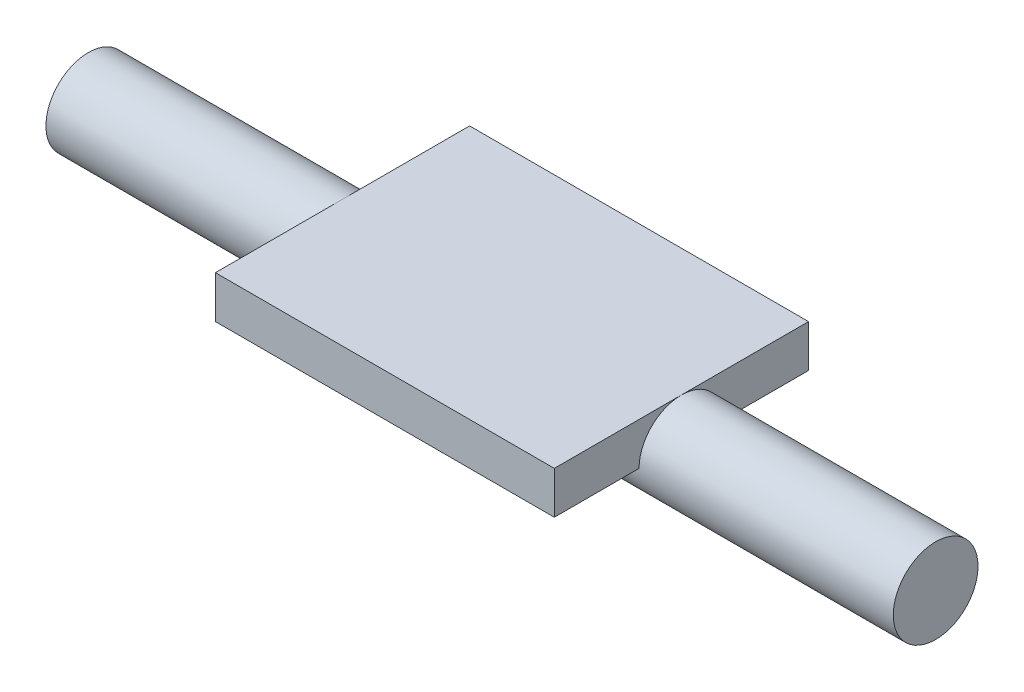
ISO-10303-21;
HEADER;
FILE_DESCRIPTION(('STEP AP214'),'2;1');
FILE_NAME('part.step','',(''),(''),'','','');
FILE_SCHEMA(('AUTOMOTIVE_DESIGN { 1 0 10303 214 1 1 1 1 }'));
ENDSEC;
DATA;
#1=APPLICATION_CONTEXT('core data for automotive mechanical design processes');
#2=APPLICATION_PROTOCOL_DEFINITION('international standard','automotive_design',2000,#1);
#3=PRODUCT_CONTEXT('',#1,'mechanical');
#4=PRODUCT('Part','Part','',(#3));
#5=PRODUCT_RELATED_PRODUCT_CATEGORY('part','',(#4));
#6=PRODUCT_DEFINITION_FORMATION('','',#4);
#7=PRODUCT_DEFINITION_CONTEXT('part definition',#1,'design');
#8=PRODUCT_DEFINITION('design','',#6,#7);
#9=PRODUCT_DEFINITION_SHAPE('','',#8);
#10=(LENGTH_UNIT() NAMED_UNIT(*) SI_UNIT(.MILLI.,.METRE.));
#11=(NAMED_UNIT(*) PLANE_ANGLE_UNIT() SI_UNIT($,.RADIAN.));
#12=(NAMED_UNIT(*) SI_UNIT($,.STERADIAN.) SOLID_ANGLE_UNIT());
#13=UNCERTAINTY_MEASURE_WITH_UNIT(LENGTH_MEASURE(1.E-05),#10,'distance_accuracy_value','');
#14=(GEOMETRIC_REPRESENTATION_CONTEXT(3) GLOBAL_UNCERTAINTY_ASSIGNED_CONTEXT((#13)) GLOBAL_UNIT_ASSIGNED_CONTEXT((#10,
#11,#12)) REPRESENTATION_CONTEXT('',''));
#15=CARTESIAN_POINT('',(0.,0.,0.));
#16=DIRECTION('',(0.,0.,1.));
#17=DIRECTION('',(1.,0.,0.));
#18=AXIS2_PLACEMENT_3D('',#15,#16,#17);
#19=CARTESIAN_POINT('',(-50.,0.,0.));
#20=DIRECTION('',(1.,0.,0.));
#21=DIRECTION('',(0.,0.,-1.));
#22=AXIS2_PLACEMENT_3D('',#19,#20,#21);
#23=CYLINDRICAL_SURFACE('',#22,2.5);
#24=CARTESIAN_POINT('',(-35.,0.,0.));
#25=DIRECTION('',(1.,0.,0.));
#26=DIRECTION('',(0.,0.,1.));
#27=AXIS2_PLACEMENT_3D('',#24,#25,#26);
#28=CIRCLE('',#27,2.5);
#29=CARTESIAN_POINT('',(-35.,0.,-2.5));
#30=VERTEX_POINT('',#29);
#31=CARTESIAN_POINT('',(-35.,2.5,0.));
#32=VERTEX_POINT('',#31);
#33=EDGE_CURVE('E124',#30,#32,#28,.T.);
#34=ORIENTED_EDGE('',*,*,#33,.F.);
#35=DIRECTION('',(1.,0.,0.));
#36=VECTOR('',#35,1.);
#37=CARTESIAN_POINT('',(-35.,0.,-2.5));
#38=LINE('',#37,#36);
#39=CARTESIAN_POINT('',(-15.,0.,-2.5));
#40=VERTEX_POINT('',#39);
#41=EDGE_CURVE('E127',#30,#40,#38,.T.);
#42=ORIENTED_EDGE('',*,*,#41,.T.);
#43=CARTESIAN_POINT('',(-15.,0.,0.));
#44=DIRECTION('',(1.,0.,0.));
#45=DIRECTION('',(0.,0.,1.));
#46=AXIS2_PLACEMENT_3D('',#43,#44,#45);
#47=CIRCLE('',#46,2.5);
#48=CARTESIAN_POINT('',(-15.,2.5,0.));
#49=VERTEX_POINT('',#48);
#50=EDGE_CURVE('E56',#40,#49,#47,.T.);
#51=ORIENTED_EDGE('',*,*,#50,.T.);
#52=CARTESIAN_POINT('',(-15.,0.,2.5));
#53=VERTEX_POINT('',#52);
#54=EDGE_CURVE('E117',#49,#53,#47,.T.);
#55=ORIENTED_EDGE('',*,*,#54,.T.);
#56=DIRECTION('',(1.,0.,0.));
#57=VECTOR('',#56,1.);
#58=CARTESIAN_POINT('',(-35.,0.,2.5));
#59=LINE('',#58,#57);
#60=CARTESIAN_POINT('',(-35.,0.,2.5));
#61=VERTEX_POINT('',#60);
#62=EDGE_CURVE('E125',#61,#53,#59,.T.);
#63=ORIENTED_EDGE('',*,*,#62,.F.);
#64=EDGE_CURVE('E49',#32,#61,#28,.T.);
#65=ORIENTED_EDGE('',*,*,#64,.F.);
#66=EDGE_LOOP('',(#34,#42,#51,#55,#63,#65));
#67=FACE_BOUND('',#66,.T.);
#68=CARTESIAN_POINT('',(-50.,0.,0.));
#69=DIRECTION('',(1.,0.,0.));
#70=DIRECTION('',(0.,0.,-1.));
#71=AXIS2_PLACEMENT_3D('',#68,#69,#70);
#72=CIRCLE('',#71,2.5);
#73=CARTESIAN_POINT('',(-50.,0.,-2.5));
#74=VERTEX_POINT('',#73);
#75=EDGE_CURVE('E11',#74,#74,#72,.T.);
#76=ORIENTED_EDGE('',*,*,#75,.T.);
#77=EDGE_LOOP('',(#76));
#78=FACE_BOUND('',#77,.T.);
#79=CARTESIAN_POINT('',(0.,0.,0.));
#80=DIRECTION('',(1.,0.,0.));
#81=DIRECTION('',(0.,0.,-1.));
#82=AXIS2_PLACEMENT_3D('',#79,#80,#81);
#83=CIRCLE('',#82,2.5);
#84=CARTESIAN_POINT('',(0.,0.,-2.5));
#85=VERTEX_POINT('',#84);
#86=EDGE_CURVE('E38',#85,#85,#83,.T.);
#87=ORIENTED_EDGE('',*,*,#86,.F.);
#88=EDGE_LOOP('',(#87));
#89=FACE_BOUND('',#88,.T.);
#90=ADVANCED_FACE('F35',(#67,#78,#89),#23,.T.);
#91=CARTESIAN_POINT('',(-50.,0.,0.));
#92=DIRECTION('',(1.,0.,0.));
#93=DIRECTION('',(0.,0.,-1.));
#94=AXIS2_PLACEMENT_3D('',#91,#92,#93);
#95=PLANE('',#94);
#96=ORIENTED_EDGE('',*,*,#75,.F.);
#97=EDGE_LOOP('',(#96));
#98=FACE_BOUND('',#97,.T.);
#99=ADVANCED_FACE('F182',(#98),#95,.F.);
#100=CARTESIAN_POINT('',(0.,0.,0.));
#101=DIRECTION('',(1.,0.,0.));
#102=DIRECTION('',(0.,0.,-1.));
#103=AXIS2_PLACEMENT_3D('',#100,#101,#102);
#104=PLANE('',#103);
#105=ORIENTED_EDGE('',*,*,#86,.T.);
#106=EDGE_LOOP('',(#105));
#107=FACE_BOUND('',#106,.T.);
#108=ADVANCED_FACE('F186',(#107),#104,.T.);
#109=CARTESIAN_POINT('',(-15.,2.5,7.5));
#110=DIRECTION('',(-1.,0.,0.));
#111=DIRECTION('',(0.,0.,1.));
#112=AXIS2_PLACEMENT_3D('',#109,#110,#111);
#113=PLANE('',#112);
#114=ORIENTED_EDGE('',*,*,#50,.F.);
#115=DIRECTION('',(0.,0.,-1.));
#116=VECTOR('',#115,1.);
#117=CARTESIAN_POINT('',(-15.,0.,7.5));
#118=LINE('',#117,#116);
#119=CARTESIAN_POINT('',(-15.,0.,-7.5));
#120=VERTEX_POINT('',#119);
#121=EDGE_CURVE('E115',#40,#120,#118,.T.);
#122=ORIENTED_EDGE('',*,*,#121,.T.);
#123=DIRECTION('',(0.,-1.,0.));
#124=VECTOR('',#123,1.);
#125=CARTESIAN_POINT('',(-15.,2.5,-7.5));
#126=LINE('',#125,#124);
#127=CARTESIAN_POINT('',(-15.,2.5,-7.5));
#128=VERTEX_POINT('',#127);
#129=EDGE_CURVE('E107',#128,#120,#126,.T.);
#130=ORIENTED_EDGE('',*,*,#129,.F.);
#131=DIRECTION('',(0.,0.,-1.));
#132=VECTOR('',#131,1.);
#133=CARTESIAN_POINT('',(-15.,2.5,7.5));
#134=LINE('',#133,#132);
#135=EDGE_CURVE('E92',#49,#128,#134,.T.);
#136=ORIENTED_EDGE('',*,*,#135,.F.);
#137=EDGE_LOOP('',(#114,#122,#130,#136));
#138=FACE_BOUND('',#137,.T.);
#139=ADVANCED_FACE('F113',(#138),#113,.F.);
#140=CARTESIAN_POINT('',(-35.,2.5,7.5));
#141=DIRECTION('',(1.,0.,0.));
#142=DIRECTION('',(0.,0.,-1.));
#143=AXIS2_PLACEMENT_3D('',#140,#141,#142);
#144=PLANE('',#143);
#145=ORIENTED_EDGE('',*,*,#64,.T.);
#146=DIRECTION('',(0.,0.,1.));
#147=VECTOR('',#146,1.);
#148=CARTESIAN_POINT('',(-35.,0.,7.5));
#149=LINE('',#148,#147);
#150=CARTESIAN_POINT('',(-35.,0.,7.5));
#151=VERTEX_POINT('',#150);
#152=EDGE_CURVE('E137',#61,#151,#149,.T.);
#153=ORIENTED_EDGE('',*,*,#152,.T.);
#154=DIRECTION('',(0.,-1.,0.));
#155=VECTOR('',#154,1.);
#156=CARTESIAN_POINT('',(-35.,2.5,7.5));
#157=LINE('',#156,#155);
#158=CARTESIAN_POINT('',(-35.,2.5,7.5));
#159=VERTEX_POINT('',#158);
#160=EDGE_CURVE('E120',#159,#151,#157,.T.);
#161=ORIENTED_EDGE('',*,*,#160,.F.);
#162=DIRECTION('',(0.,0.,1.));
#163=VECTOR('',#162,1.);
#164=CARTESIAN_POINT('',(-35.,2.5,7.5));
#165=LINE('',#164,#163);
#166=EDGE_CURVE('E111',#32,#159,#165,.T.);
#167=ORIENTED_EDGE('',*,*,#166,.F.);
#168=EDGE_LOOP('',(#145,#153,#161,#167));
#169=FACE_BOUND('',#168,.T.);
#170=ADVANCED_FACE('F161',(#169),#144,.F.);
#171=CARTESIAN_POINT('',(0.,0.,0.));
#172=DIRECTION('',(0.,-1.,0.));
#173=DIRECTION('',(0.,0.,-1.));
#174=AXIS2_PLACEMENT_3D('',#171,#172,#173);
#175=PLANE('',#174);
#176=ORIENTED_EDGE('',*,*,#121,.F.);
#177=ORIENTED_EDGE('',*,*,#41,.F.);
#178=CARTESIAN_POINT('',(-35.,0.,-7.5));
#179=VERTEX_POINT('',#178);
#180=EDGE_CURVE('E150',#179,#30,#149,.T.);
#181=ORIENTED_EDGE('',*,*,#180,.F.);
#182=DIRECTION('',(-1.,0.,0.));
#183=VECTOR('',#182,1.);
#184=CARTESIAN_POINT('',(-35.,0.,-7.5));
#185=LINE('',#184,#183);
#186=EDGE_CURVE('E143',#120,#179,#185,.T.);
#187=ORIENTED_EDGE('',*,*,#186,.F.);
#188=EDGE_LOOP('',(#176,#177,#181,#187));
#189=FACE_BOUND('',#188,.T.);
#190=ADVANCED_FACE('F169',(#189),#175,.T.);
#191=ORIENTED_EDGE('',*,*,#54,.F.);
#192=CARTESIAN_POINT('',(-15.,2.5,7.5));
#193=VERTEX_POINT('',#192);
#194=EDGE_CURVE('E99',#193,#49,#134,.T.);
#195=ORIENTED_EDGE('',*,*,#194,.F.);
#196=DIRECTION('',(0.,-1.,0.));
#197=VECTOR('',#196,1.);
#198=CARTESIAN_POINT('',(-15.,2.5,7.5));
#199=LINE('',#198,#197);
#200=CARTESIAN_POINT('',(-15.,0.,7.5));
#201=VERTEX_POINT('',#200);
#202=EDGE_CURVE('E142',#193,#201,#199,.T.);
#203=ORIENTED_EDGE('',*,*,#202,.T.);
#204=EDGE_CURVE('E136',#201,#53,#118,.T.);
#205=ORIENTED_EDGE('',*,*,#204,.T.);
#206=EDGE_LOOP('',(#191,#195,#203,#205));
#207=FACE_BOUND('',#206,.T.);
#208=ADVANCED_FACE('F140',(#207),#113,.F.);
#209=CARTESIAN_POINT('',(-35.,2.5,-7.5));
#210=DIRECTION('',(0.,0.,1.));
#211=DIRECTION('',(1.,0.,0.));
#212=AXIS2_PLACEMENT_3D('',#209,#210,#211);
#213=PLANE('',#212);
#214=ORIENTED_EDGE('',*,*,#186,.T.);
#215=DIRECTION('',(0.,-1.,0.));
#216=VECTOR('',#215,1.);
#217=CARTESIAN_POINT('',(-35.,2.5,-7.5));
#218=LINE('',#217,#216);
#219=CARTESIAN_POINT('',(-35.,2.5,-7.5));
#220=VERTEX_POINT('',#219);
#221=EDGE_CURVE('E109',#220,#179,#218,.T.);
#222=ORIENTED_EDGE('',*,*,#221,.F.);
#223=DIRECTION('',(-1.,0.,0.));
#224=VECTOR('',#223,1.);
#225=CARTESIAN_POINT('',(-35.,2.5,-7.5));
#226=LINE('',#225,#224);
#227=EDGE_CURVE('E96',#128,#220,#226,.T.);
#228=ORIENTED_EDGE('',*,*,#227,.F.);
#229=ORIENTED_EDGE('',*,*,#129,.T.);
#230=EDGE_LOOP('',(#214,#222,#228,#229));
#231=FACE_BOUND('',#230,.T.);
#232=ADVANCED_FACE('F106',(#231),#213,.F.);
#233=ORIENTED_EDGE('',*,*,#33,.T.);
#234=EDGE_CURVE('E162',#220,#32,#165,.T.);
#235=ORIENTED_EDGE('',*,*,#234,.F.);
#236=ORIENTED_EDGE('',*,*,#221,.T.);
#237=ORIENTED_EDGE('',*,*,#180,.T.);
#238=EDGE_LOOP('',(#233,#235,#236,#237));
#239=FACE_BOUND('',#238,.T.);
#240=ADVANCED_FACE('F164',(#239),#144,.F.);
#241=CARTESIAN_POINT('',(-35.,2.5,7.5));
#242=DIRECTION('',(0.,0.,-1.));
#243=DIRECTION('',(-1.,0.,0.));
#244=AXIS2_PLACEMENT_3D('',#241,#242,#243);
#245=PLANE('',#244);
#246=DIRECTION('',(1.,0.,0.));
#247=VECTOR('',#246,1.);
#248=CARTESIAN_POINT('',(-35.,0.,7.5));
#249=LINE('',#248,#247);
#250=EDGE_CURVE('E102',#151,#201,#249,.T.);
#251=ORIENTED_EDGE('',*,*,#250,.T.);
#252=ORIENTED_EDGE('',*,*,#202,.F.);
#253=DIRECTION('',(1.,0.,0.));
#254=VECTOR('',#253,1.);
#255=CARTESIAN_POINT('',(-35.,2.5,7.5));
#256=LINE('',#255,#254);
#257=EDGE_CURVE('E147',#159,#193,#256,.T.);
#258=ORIENTED_EDGE('',*,*,#257,.F.);
#259=ORIENTED_EDGE('',*,*,#160,.T.);
#260=EDGE_LOOP('',(#251,#252,#258,#259));
#261=FACE_BOUND('',#260,.T.);
#262=ADVANCED_FACE('F158',(#261),#245,.F.);
#263=CARTESIAN_POINT('',(0.,2.5,0.));
#264=DIRECTION('',(0.,-1.,0.));
#265=DIRECTION('',(0.,0.,-1.));
#266=AXIS2_PLACEMENT_3D('',#263,#264,#265);
#267=PLANE('',#266);
#268=ORIENTED_EDGE('',*,*,#194,.T.);
#269=ORIENTED_EDGE('',*,*,#135,.T.);
#270=ORIENTED_EDGE('',*,*,#227,.T.);
#271=ORIENTED_EDGE('',*,*,#234,.T.);
#272=ORIENTED_EDGE('',*,*,#166,.T.);
#273=ORIENTED_EDGE('',*,*,#257,.T.);
#274=EDGE_LOOP('',(#268,#269,#270,#271,#272,#273));
#275=FACE_BOUND('',#274,.T.);
#276=ADVANCED_FACE('F94',(#275),#267,.F.);
#277=ORIENTED_EDGE('',*,*,#152,.F.);
#278=ORIENTED_EDGE('',*,*,#62,.T.);
#279=ORIENTED_EDGE('',*,*,#204,.F.);
#280=ORIENTED_EDGE('',*,*,#250,.F.);
#281=EDGE_LOOP('',(#277,#278,#279,#280));
#282=FACE_BOUND('',#281,.T.);
#283=ADVANCED_FACE('F134',(#282),#175,.T.);
#284=CLOSED_SHELL('',(#90,#99,#108,#139,#170,#190,#208,#232,#240,#262,#276,#283));
#285=MANIFOLD_SOLID_BREP('B2',#284);
#286=ADVANCED_BREP_SHAPE_REPRESENTATION('',(#18,#285),#14);
#287=SHAPE_DEFINITION_REPRESENTATION(#9,#286);
ENDSEC;
END-ISO-10303-21;
